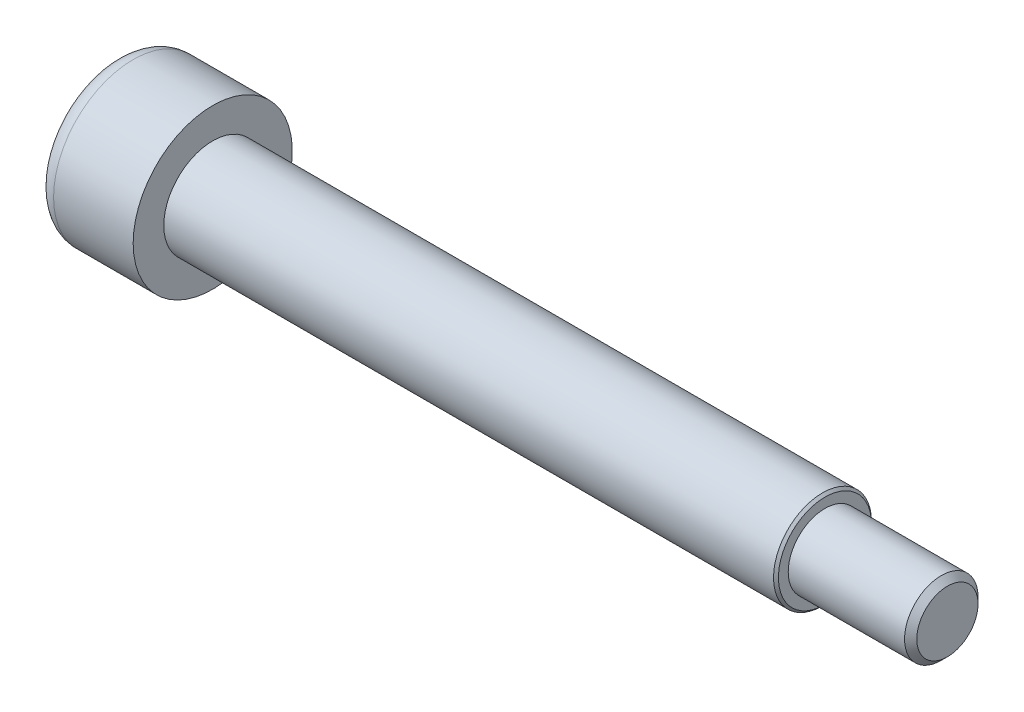
ISO-10303-21;
HEADER;
FILE_DESCRIPTION(('STEP AP214'),'2;1');
FILE_NAME('part.step','',(''),(''),'','','');
FILE_SCHEMA(('AUTOMOTIVE_DESIGN { 1 0 10303 214 1 1 1 1 }'));
ENDSEC;
DATA;
#1=APPLICATION_CONTEXT('core data for automotive mechanical design processes');
#2=APPLICATION_PROTOCOL_DEFINITION('international standard','automotive_design',2000,#1);
#3=PRODUCT_CONTEXT('',#1,'mechanical');
#4=PRODUCT('Part','Part','',(#3));
#5=PRODUCT_RELATED_PRODUCT_CATEGORY('part','',(#4));
#6=PRODUCT_DEFINITION_FORMATION('','',#4);
#7=PRODUCT_DEFINITION_CONTEXT('part definition',#1,'design');
#8=PRODUCT_DEFINITION('design','',#6,#7);
#9=PRODUCT_DEFINITION_SHAPE('','',#8);
#10=(LENGTH_UNIT() NAMED_UNIT(*) SI_UNIT(.MILLI.,.METRE.));
#11=(NAMED_UNIT(*) PLANE_ANGLE_UNIT() SI_UNIT($,.RADIAN.));
#12=(NAMED_UNIT(*) SI_UNIT($,.STERADIAN.) SOLID_ANGLE_UNIT());
#13=UNCERTAINTY_MEASURE_WITH_UNIT(LENGTH_MEASURE(1.E-05),#10,'distance_accuracy_value','');
#14=(GEOMETRIC_REPRESENTATION_CONTEXT(3) GLOBAL_UNCERTAINTY_ASSIGNED_CONTEXT((#13)) GLOBAL_UNIT_ASSIGNED_CONTEXT((#10,
#11,#12)) REPRESENTATION_CONTEXT('',''));
#15=CARTESIAN_POINT('',(0.,0.,0.));
#16=DIRECTION('',(0.,0.,1.));
#17=DIRECTION('',(1.,0.,0.));
#18=AXIS2_PLACEMENT_3D('',#15,#16,#17);
#19=CARTESIAN_POINT('',(60.,0.,0.));
#20=DIRECTION('',(1.,0.,0.));
#21=DIRECTION('',(0.,0.,-1.));
#22=AXIS2_PLACEMENT_3D('',#19,#20,#21);
#23=PLANE('',#22);
#24=CARTESIAN_POINT('',(60.,0.,0.));
#25=DIRECTION('',(1.,0.,0.));
#26=DIRECTION('',(0.,0.,-1.));
#27=AXIS2_PLACEMENT_3D('',#24,#25,#26);
#28=CIRCLE('',#27,2.5);
#29=CARTESIAN_POINT('',(60.,0.,-2.5));
#30=VERTEX_POINT('',#29);
#31=EDGE_CURVE('E51',#30,#30,#28,.T.);
#32=ORIENTED_EDGE('',*,*,#31,.T.);
#33=EDGE_LOOP('',(#32));
#34=FACE_BOUND('',#33,.T.);
#35=ADVANCED_FACE('F32',(#34),#23,.T.);
#36=CARTESIAN_POINT('',(0.,0.,0.));
#37=DIRECTION('',(-1.,0.,0.));
#38=DIRECTION('',(0.,0.,1.));
#39=AXIS2_PLACEMENT_3D('',#36,#37,#38);
#40=CYLINDRICAL_SURFACE('',#39,3.);
#41=CARTESIAN_POINT('',(59.5,0.,0.));
#42=DIRECTION('',(1.,0.,0.));
#43=DIRECTION('',(0.,0.,-1.));
#44=AXIS2_PLACEMENT_3D('',#41,#42,#43);
#45=CIRCLE('',#44,3.);
#46=CARTESIAN_POINT('',(59.5,0.,-3.));
#47=VERTEX_POINT('',#46);
#48=EDGE_CURVE('E54',#47,#47,#45,.F.);
#49=ORIENTED_EDGE('',*,*,#48,.T.);
#50=EDGE_LOOP('',(#49));
#51=FACE_BOUND('',#50,.T.);
#52=CARTESIAN_POINT('',(50.,0.,0.));
#53=DIRECTION('',(-1.,0.,0.));
#54=DIRECTION('',(0.,0.,1.));
#55=AXIS2_PLACEMENT_3D('',#52,#53,#54);
#56=CIRCLE('',#55,3.);
#57=CARTESIAN_POINT('',(50.,0.,3.));
#58=VERTEX_POINT('',#57);
#59=EDGE_CURVE('E57',#58,#58,#56,.T.);
#60=ORIENTED_EDGE('',*,*,#59,.F.);
#61=EDGE_LOOP('',(#60));
#62=FACE_BOUND('',#61,.T.);
#63=ADVANCED_FACE('F84',(#51,#62),#40,.T.);
#64=CARTESIAN_POINT('',(50.,-3.,0.));
#65=DIRECTION('',(1.,0.,0.));
#66=DIRECTION('',(0.,0.,-1.));
#67=AXIS2_PLACEMENT_3D('',#64,#65,#66);
#68=PLANE('',#67);
#69=CARTESIAN_POINT('',(50.,0.,0.));
#70=DIRECTION('',(1.,0.,0.));
#71=DIRECTION('',(0.,0.,-1.));
#72=AXIS2_PLACEMENT_3D('',#69,#70,#71);
#73=CIRCLE('',#72,3.8);
#74=CARTESIAN_POINT('',(50.,0.,-3.8));
#75=VERTEX_POINT('',#74);
#76=EDGE_CURVE('E10',#75,#75,#73,.T.);
#77=ORIENTED_EDGE('',*,*,#76,.T.);
#78=EDGE_LOOP('',(#77));
#79=FACE_BOUND('',#78,.T.);
#80=ORIENTED_EDGE('',*,*,#59,.T.);
#81=EDGE_LOOP('',(#80));
#82=FACE_BOUND('',#81,.T.);
#83=ADVANCED_FACE('F81',(#79,#82),#68,.T.);
#84=CARTESIAN_POINT('',(0.,0.,0.));
#85=DIRECTION('',(-1.,0.,0.));
#86=DIRECTION('',(0.,0.,1.));
#87=AXIS2_PLACEMENT_3D('',#84,#85,#86);
#88=CYLINDRICAL_SURFACE('',#87,4.);
#89=CARTESIAN_POINT('',(49.8,0.,0.));
#90=DIRECTION('',(1.,0.,0.));
#91=DIRECTION('',(0.,0.,-1.));
#92=AXIS2_PLACEMENT_3D('',#89,#90,#91);
#93=CIRCLE('',#92,4.);
#94=CARTESIAN_POINT('',(49.8,0.,-4.));
#95=VERTEX_POINT('',#94);
#96=EDGE_CURVE('E38',#95,#95,#93,.F.);
#97=ORIENTED_EDGE('',*,*,#96,.T.);
#98=EDGE_LOOP('',(#97));
#99=FACE_BOUND('',#98,.T.);
#100=CARTESIAN_POINT('',(0.,0.,0.));
#101=DIRECTION('',(-1.,0.,0.));
#102=DIRECTION('',(0.,0.,1.));
#103=AXIS2_PLACEMENT_3D('',#100,#101,#102);
#104=CIRCLE('',#103,4.);
#105=CARTESIAN_POINT('',(0.,0.,4.));
#106=VERTEX_POINT('',#105);
#107=EDGE_CURVE('E60',#106,#106,#104,.T.);
#108=ORIENTED_EDGE('',*,*,#107,.F.);
#109=EDGE_LOOP('',(#108));
#110=FACE_BOUND('',#109,.T.);
#111=ADVANCED_FACE('F71',(#99,#110),#88,.T.);
#112=CARTESIAN_POINT('',(0.,-4.,0.));
#113=DIRECTION('',(1.,0.,0.));
#114=DIRECTION('',(0.,0.,-1.));
#115=AXIS2_PLACEMENT_3D('',#112,#113,#114);
#116=PLANE('',#115);
#117=ORIENTED_EDGE('',*,*,#107,.T.);
#118=EDGE_LOOP('',(#117));
#119=FACE_BOUND('',#118,.T.);
#120=CARTESIAN_POINT('',(0.,0.,0.));
#121=DIRECTION('',(-1.,0.,0.));
#122=DIRECTION('',(0.,0.,1.));
#123=AXIS2_PLACEMENT_3D('',#120,#121,#122);
#124=CIRCLE('',#123,6.5);
#125=CARTESIAN_POINT('',(0.,0.,6.5));
#126=VERTEX_POINT('',#125);
#127=EDGE_CURVE('E63',#126,#126,#124,.T.);
#128=ORIENTED_EDGE('',*,*,#127,.F.);
#129=EDGE_LOOP('',(#128));
#130=FACE_BOUND('',#129,.T.);
#131=ADVANCED_FACE('F69',(#119,#130),#116,.T.);
#132=CARTESIAN_POINT('',(0.,0.,0.));
#133=DIRECTION('',(-1.,0.,0.));
#134=DIRECTION('',(0.,0.,1.));
#135=AXIS2_PLACEMENT_3D('',#132,#133,#134);
#136=CYLINDRICAL_SURFACE('',#135,6.5);
#137=CARTESIAN_POINT('',(-6.5,0.,0.));
#138=DIRECTION('',(-1.,0.,0.));
#139=DIRECTION('',(0.,0.,1.));
#140=AXIS2_PLACEMENT_3D('',#137,#138,#139);
#141=CIRCLE('',#140,6.5);
#142=CARTESIAN_POINT('',(-6.5,0.,6.5));
#143=VERTEX_POINT('',#142);
#144=EDGE_CURVE('E42',#143,#143,#141,.F.);
#145=ORIENTED_EDGE('',*,*,#144,.T.);
#146=EDGE_LOOP('',(#145));
#147=FACE_BOUND('',#146,.T.);
#148=ORIENTED_EDGE('',*,*,#127,.T.);
#149=EDGE_LOOP('',(#148));
#150=FACE_BOUND('',#149,.T.);
#151=ADVANCED_FACE('F67',(#147,#150),#136,.T.);
#152=CARTESIAN_POINT('',(-8.,-6.5,0.));
#153=DIRECTION('',(-1.,0.,0.));
#154=DIRECTION('',(0.,0.,1.));
#155=AXIS2_PLACEMENT_3D('',#152,#153,#154);
#156=PLANE('',#155);
#157=CARTESIAN_POINT('',(-8.,0.,0.));
#158=DIRECTION('',(-1.,0.,0.));
#159=DIRECTION('',(0.,0.,1.));
#160=AXIS2_PLACEMENT_3D('',#157,#158,#159);
#161=CIRCLE('',#160,5.);
#162=CARTESIAN_POINT('',(-8.,0.,5.));
#163=VERTEX_POINT('',#162);
#164=EDGE_CURVE('E46',#163,#163,#161,.T.);
#165=ORIENTED_EDGE('',*,*,#164,.T.);
#166=EDGE_LOOP('',(#165));
#167=FACE_BOUND('',#166,.T.);
#168=ADVANCED_FACE('F78',(#167),#156,.T.);
#169=CARTESIAN_POINT('',(59.5,0.,0.));
#170=DIRECTION('',(-1.,0.,0.));
#171=DIRECTION('',(0.,0.,1.));
#172=AXIS2_PLACEMENT_3D('',#169,#170,#171);
#173=CONICAL_SURFACE('',#172,3.,0.785398163397444);
#174=ORIENTED_EDGE('',*,*,#31,.F.);
#175=EDGE_LOOP('',(#174));
#176=FACE_BOUND('',#175,.T.);
#177=ORIENTED_EDGE('',*,*,#48,.F.);
#178=EDGE_LOOP('',(#177));
#179=FACE_BOUND('',#178,.T.);
#180=ADVANCED_FACE('F92',(#176,#179),#173,.T.);
#181=CARTESIAN_POINT('',(-6.5,0.,0.));
#182=DIRECTION('',(-1.,0.,0.));
#183=DIRECTION('',(0.,0.,1.));
#184=AXIS2_PLACEMENT_3D('',#181,#182,#183);
#185=TOROIDAL_SURFACE('',#184,5.,1.5);
#186=ORIENTED_EDGE('',*,*,#144,.F.);
#187=EDGE_LOOP('',(#186));
#188=FACE_BOUND('',#187,.T.);
#189=ORIENTED_EDGE('',*,*,#164,.F.);
#190=EDGE_LOOP('',(#189));
#191=FACE_BOUND('',#190,.T.);
#192=ADVANCED_FACE('F95',(#188,#191),#185,.T.);
#193=CARTESIAN_POINT('',(49.8,0.,0.));
#194=DIRECTION('',(-1.,0.,0.));
#195=DIRECTION('',(0.,0.,1.));
#196=AXIS2_PLACEMENT_3D('',#193,#194,#195);
#197=CONICAL_SURFACE('',#196,4.,0.785398163397441);
#198=ORIENTED_EDGE('',*,*,#76,.F.);
#199=EDGE_LOOP('',(#198));
#200=FACE_BOUND('',#199,.T.);
#201=ORIENTED_EDGE('',*,*,#96,.F.);
#202=EDGE_LOOP('',(#201));
#203=FACE_BOUND('',#202,.T.);
#204=ADVANCED_FACE('F118',(#200,#203),#197,.T.);
#205=CLOSED_SHELL('',(#35,#63,#83,#111,#131,#151,#168,#180,#192,#204));
#206=MANIFOLD_SOLID_BREP('B2',#205);
#207=ADVANCED_BREP_SHAPE_REPRESENTATION('',(#18,#206),#14);
#208=SHAPE_DEFINITION_REPRESENTATION(#9,#207);
ENDSEC;
END-ISO-10303-21;
